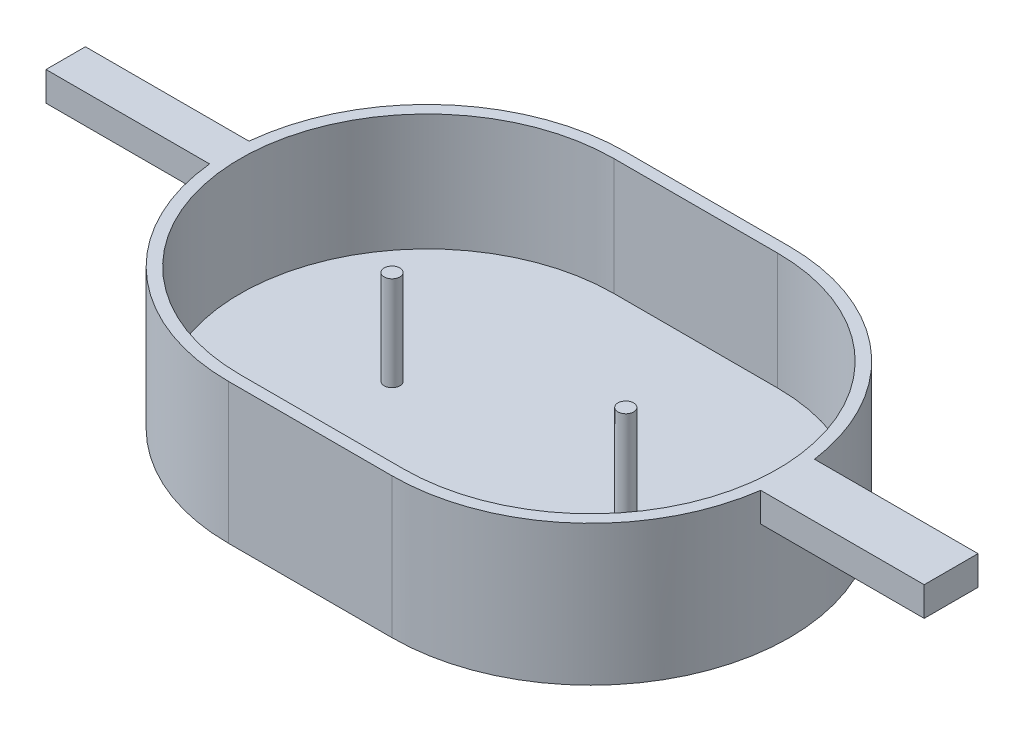
ISO-10303-21;
HEADER;
FILE_DESCRIPTION(('STEP AP214'),'2;1');
FILE_NAME('part.step','',(''),(''),'','','');
FILE_SCHEMA(('AUTOMOTIVE_DESIGN { 1 0 10303 214 1 1 1 1 }'));
ENDSEC;
DATA;
#1=APPLICATION_CONTEXT('core data for automotive mechanical design processes');
#2=APPLICATION_PROTOCOL_DEFINITION('international standard','automotive_design',2000,#1);
#3=PRODUCT_CONTEXT('',#1,'mechanical');
#4=PRODUCT('Part','Part','',(#3));
#5=PRODUCT_RELATED_PRODUCT_CATEGORY('part','',(#4));
#6=PRODUCT_DEFINITION_FORMATION('','',#4);
#7=PRODUCT_DEFINITION_CONTEXT('part definition',#1,'design');
#8=PRODUCT_DEFINITION('design','',#6,#7);
#9=PRODUCT_DEFINITION_SHAPE('','',#8);
#10=(LENGTH_UNIT() NAMED_UNIT(*) SI_UNIT(.MILLI.,.METRE.));
#11=(NAMED_UNIT(*) PLANE_ANGLE_UNIT() SI_UNIT($,.RADIAN.));
#12=(NAMED_UNIT(*) SI_UNIT($,.STERADIAN.) SOLID_ANGLE_UNIT());
#13=UNCERTAINTY_MEASURE_WITH_UNIT(LENGTH_MEASURE(1.E-05),#10,'distance_accuracy_value','');
#14=(GEOMETRIC_REPRESENTATION_CONTEXT(3) GLOBAL_UNCERTAINTY_ASSIGNED_CONTEXT((#13)) GLOBAL_UNIT_ASSIGNED_CONTEXT((#10,
#11,#12)) REPRESENTATION_CONTEXT('',''));
#15=CARTESIAN_POINT('',(0.,0.,0.));
#16=DIRECTION('',(0.,0.,1.));
#17=DIRECTION('',(1.,0.,0.));
#18=AXIS2_PLACEMENT_3D('',#15,#16,#17);
#19=CARTESIAN_POINT('',(0.,25.4,0.));
#20=DIRECTION('',(0.,1.,0.));
#21=DIRECTION('',(0.,0.,1.));
#22=AXIS2_PLACEMENT_3D('',#19,#20,#21);
#23=PLANE('',#22);
#24=DIRECTION('',(1.,0.,0.));
#25=VECTOR('',#24,1.);
#26=CARTESIAN_POINT('',(0.,25.4,40.64));
#27=LINE('',#26,#25);
#28=CARTESIAN_POINT('',(0.,25.4,40.64));
#29=VERTEX_POINT('',#28);
#30=CARTESIAN_POINT('',(35.56,25.4,40.64));
#31=VERTEX_POINT('',#30);
#32=EDGE_CURVE('E277',#29,#31,#27,.T.);
#33=ORIENTED_EDGE('',*,*,#32,.F.);
#34=CARTESIAN_POINT('',(0.,25.4,0.));
#35=DIRECTION('',(0.,1.,0.));
#36=DIRECTION('',(0.,0.,1.));
#37=AXIS2_PLACEMENT_3D('',#34,#35,#36);
#38=CIRCLE('',#37,40.64);
#39=CARTESIAN_POINT('',(0.,25.4,-40.64));
#40=VERTEX_POINT('',#39);
#41=EDGE_CURVE('E274',#40,#29,#38,.T.);
#42=ORIENTED_EDGE('',*,*,#41,.F.);
#43=DIRECTION('',(-1.,0.,0.));
#44=VECTOR('',#43,1.);
#45=CARTESIAN_POINT('',(0.,25.4,-40.64));
#46=LINE('',#45,#44);
#47=CARTESIAN_POINT('',(35.56,25.4,-40.64));
#48=VERTEX_POINT('',#47);
#49=EDGE_CURVE('E284',#48,#40,#46,.T.);
#50=ORIENTED_EDGE('',*,*,#49,.F.);
#51=CARTESIAN_POINT('',(35.56,25.4,0.));
#52=DIRECTION('',(0.,1.,0.));
#53=DIRECTION('',(0.,0.,1.));
#54=AXIS2_PLACEMENT_3D('',#51,#52,#53);
#55=CIRCLE('',#54,40.64);
#56=EDGE_CURVE('E281',#31,#48,#55,.T.);
#57=ORIENTED_EDGE('',*,*,#56,.F.);
#58=EDGE_LOOP('',(#33,#42,#50,#57));
#59=FACE_BOUND('',#58,.T.);
#60=DIRECTION('',(1.,0.,0.));
#61=VECTOR('',#60,1.);
#62=CARTESIAN_POINT('',(-40.411061774154,25.4,4.30763116869485));
#63=LINE('',#62,#61);
#64=CARTESIAN_POINT('',(-78.5163769047991,25.4,4.30763116869485));
#65=VERTEX_POINT('',#64);
#66=CARTESIAN_POINT('',(-42.9645983772046,25.4,4.30763116869485));
#67=VERTEX_POINT('',#66);
#68=EDGE_CURVE('E61',#65,#67,#63,.T.);
#69=ORIENTED_EDGE('',*,*,#68,.T.);
#70=CARTESIAN_POINT('',(0.,25.4,0.));
#71=DIRECTION('',(0.,1.,0.));
#72=DIRECTION('',(0.,0.,1.));
#73=AXIS2_PLACEMENT_3D('',#70,#71,#72);
#74=CIRCLE('',#73,43.18);
#75=CARTESIAN_POINT('',(0.,25.4,43.18));
#76=VERTEX_POINT('',#75);
#77=EDGE_CURVE('E314',#67,#76,#74,.T.);
#78=ORIENTED_EDGE('',*,*,#77,.T.);
#79=DIRECTION('',(1.,0.,0.));
#80=VECTOR('',#79,1.);
#81=CARTESIAN_POINT('',(0.,25.4,43.18));
#82=LINE('',#81,#80);
#83=CARTESIAN_POINT('',(35.56,25.4,43.18));
#84=VERTEX_POINT('',#83);
#85=EDGE_CURVE('E318',#76,#84,#82,.T.);
#86=ORIENTED_EDGE('',*,*,#85,.T.);
#87=CARTESIAN_POINT('',(35.56,25.4,0.));
#88=DIRECTION('',(0.,1.,0.));
#89=DIRECTION('',(0.,0.,1.));
#90=AXIS2_PLACEMENT_3D('',#87,#88,#89);
#91=CIRCLE('',#90,43.18);
#92=CARTESIAN_POINT('',(78.3422455503844,25.4,5.84738109469622));
#93=VERTEX_POINT('',#92);
#94=EDGE_CURVE('E322',#84,#93,#91,.T.);
#95=ORIENTED_EDGE('',*,*,#94,.T.);
#96=DIRECTION('',(1.,0.,0.));
#97=VECTOR('',#96,1.);
#98=CARTESIAN_POINT('',(75.777132348458,25.4,5.84738109469622));
#99=LINE('',#98,#97);
#100=CARTESIAN_POINT('',(113.877132348458,25.4,5.84738109469622));
#101=VERTEX_POINT('',#100);
#102=EDGE_CURVE('E203',#93,#101,#99,.T.);
#103=ORIENTED_EDGE('',*,*,#102,.T.);
#104=DIRECTION('',(0.,0.,-1.));
#105=VECTOR('',#104,1.);
#106=CARTESIAN_POINT('',(113.877132348458,25.4,-5.84738109469624));
#107=LINE('',#106,#105);
#108=CARTESIAN_POINT('',(113.877132348458,25.4,-5.84738109469624));
#109=VERTEX_POINT('',#108);
#110=EDGE_CURVE('E218',#101,#109,#107,.T.);
#111=ORIENTED_EDGE('',*,*,#110,.T.);
#112=DIRECTION('',(-1.,0.,0.));
#113=VECTOR('',#112,1.);
#114=CARTESIAN_POINT('',(75.777132348458,25.4,-5.84738109469624));
#115=LINE('',#114,#113);
#116=CARTESIAN_POINT('',(78.3422455503844,25.4,-5.84738109469624));
#117=VERTEX_POINT('',#116);
#118=EDGE_CURVE('E68',#109,#117,#115,.T.);
#119=ORIENTED_EDGE('',*,*,#118,.T.);
#120=CARTESIAN_POINT('',(35.56,25.4,-43.18));
#121=VERTEX_POINT('',#120);
#122=EDGE_CURVE('E321',#117,#121,#91,.T.);
#123=ORIENTED_EDGE('',*,*,#122,.T.);
#124=DIRECTION('',(-1.,0.,0.));
#125=VECTOR('',#124,1.);
#126=CARTESIAN_POINT('',(0.,25.4,-43.18));
#127=LINE('',#126,#125);
#128=CARTESIAN_POINT('',(0.,25.4,-43.18));
#129=VERTEX_POINT('',#128);
#130=EDGE_CURVE('E326',#121,#129,#127,.T.);
#131=ORIENTED_EDGE('',*,*,#130,.T.);
#132=CARTESIAN_POINT('',(-42.9695976489282,25.4,-4.25747318126848));
#133=VERTEX_POINT('',#132);
#134=EDGE_CURVE('E315',#129,#133,#74,.T.);
#135=ORIENTED_EDGE('',*,*,#134,.T.);
#136=DIRECTION('',(-1.,0.,0.));
#137=VECTOR('',#136,1.);
#138=CARTESIAN_POINT('',(-40.4163769047991,25.4,-4.25747318126848));
#139=LINE('',#138,#137);
#140=CARTESIAN_POINT('',(-78.5163769047991,25.4,-4.25747318126848));
#141=VERTEX_POINT('',#140);
#142=EDGE_CURVE('E172',#133,#141,#139,.T.);
#143=ORIENTED_EDGE('',*,*,#142,.T.);
#144=DIRECTION('',(0.,0.,1.));
#145=VECTOR('',#144,1.);
#146=CARTESIAN_POINT('',(-78.5163769047991,25.4,-4.25747318126848));
#147=LINE('',#146,#145);
#148=EDGE_CURVE('E162',#141,#65,#147,.T.);
#149=ORIENTED_EDGE('',*,*,#148,.T.);
#150=EDGE_LOOP('',(#69,#78,#86,#95,#103,#111,#119,#123,#131,#135,#143,#149));
#151=FACE_BOUND('',#150,.T.);
#152=ADVANCED_FACE('F45',(#59,#151),#23,.T.);
#153=CARTESIAN_POINT('',(0.,25.4,0.));
#154=DIRECTION('',(0.,-1.,0.));
#155=DIRECTION('',(0.,0.,-1.));
#156=AXIS2_PLACEMENT_3D('',#153,#154,#155);
#157=CYLINDRICAL_SURFACE('',#156,43.18);
#158=ORIENTED_EDGE('',*,*,#77,.F.);
#159=DIRECTION('',(0.,-1.,0.));
#160=VECTOR('',#159,1.);
#161=CARTESIAN_POINT('',(-42.9645983772046,25.4,4.30763116869485));
#162=LINE('',#161,#160);
#163=CARTESIAN_POINT('',(-42.9645983772046,19.05,4.30763116869485));
#164=VERTEX_POINT('',#163);
#165=EDGE_CURVE('E178',#67,#164,#162,.T.);
#166=ORIENTED_EDGE('',*,*,#165,.T.);
#167=CARTESIAN_POINT('',(0.,19.05,0.));
#168=DIRECTION('',(0.,1.,0.));
#169=DIRECTION('',(0.,0.,1.));
#170=AXIS2_PLACEMENT_3D('',#167,#168,#169);
#171=CIRCLE('',#170,43.18);
#172=CARTESIAN_POINT('',(-42.9695976489282,19.05,-4.25747318126848));
#173=VERTEX_POINT('',#172);
#174=EDGE_CURVE('E189',#173,#164,#171,.T.);
#175=ORIENTED_EDGE('',*,*,#174,.F.);
#176=DIRECTION('',(0.,-1.,0.));
#177=VECTOR('',#176,1.);
#178=CARTESIAN_POINT('',(-42.9695976489282,25.4,-4.25747318126848));
#179=LINE('',#178,#177);
#180=EDGE_CURVE('E197',#173,#133,#179,.F.);
#181=ORIENTED_EDGE('',*,*,#180,.T.);
#182=ORIENTED_EDGE('',*,*,#134,.F.);
#183=DIRECTION('',(0.,-1.,0.));
#184=VECTOR('',#183,1.);
#185=CARTESIAN_POINT('',(0.,25.4,-43.18));
#186=LINE('',#185,#184);
#187=CARTESIAN_POINT('',(0.,-5.08,-43.18));
#188=VERTEX_POINT('',#187);
#189=EDGE_CURVE('E329',#129,#188,#186,.T.);
#190=ORIENTED_EDGE('',*,*,#189,.T.);
#191=CARTESIAN_POINT('',(0.,-5.08,0.));
#192=DIRECTION('',(0.,1.,0.));
#193=DIRECTION('',(0.,0.,1.));
#194=AXIS2_PLACEMENT_3D('',#191,#192,#193);
#195=CIRCLE('',#194,43.18);
#196=CARTESIAN_POINT('',(0.,-5.08,43.18));
#197=VERTEX_POINT('',#196);
#198=EDGE_CURVE('E254',#188,#197,#195,.T.);
#199=ORIENTED_EDGE('',*,*,#198,.T.);
#200=DIRECTION('',(0.,-1.,0.));
#201=VECTOR('',#200,1.);
#202=CARTESIAN_POINT('',(0.,25.4,43.18));
#203=LINE('',#202,#201);
#204=EDGE_CURVE('E11',#76,#197,#203,.T.);
#205=ORIENTED_EDGE('',*,*,#204,.F.);
#206=EDGE_LOOP('',(#158,#166,#175,#181,#182,#190,#199,#205));
#207=FACE_BOUND('',#206,.T.);
#208=ADVANCED_FACE('F47',(#207),#157,.T.);
#209=CARTESIAN_POINT('',(0.,25.4,43.18));
#210=DIRECTION('',(0.,0.,-1.));
#211=DIRECTION('',(-1.,0.,0.));
#212=AXIS2_PLACEMENT_3D('',#209,#210,#211);
#213=PLANE('',#212);
#214=ORIENTED_EDGE('',*,*,#204,.T.);
#215=DIRECTION('',(1.,0.,0.));
#216=VECTOR('',#215,1.);
#217=CARTESIAN_POINT('',(0.,-5.08,43.18));
#218=LINE('',#217,#216);
#219=CARTESIAN_POINT('',(35.56,-5.08,43.18));
#220=VERTEX_POINT('',#219);
#221=EDGE_CURVE('E261',#197,#220,#218,.T.);
#222=ORIENTED_EDGE('',*,*,#221,.T.);
#223=DIRECTION('',(0.,-1.,0.));
#224=VECTOR('',#223,1.);
#225=CARTESIAN_POINT('',(35.56,25.4,43.18));
#226=LINE('',#225,#224);
#227=EDGE_CURVE('E54',#84,#220,#226,.T.);
#228=ORIENTED_EDGE('',*,*,#227,.F.);
#229=ORIENTED_EDGE('',*,*,#85,.F.);
#230=EDGE_LOOP('',(#214,#222,#228,#229));
#231=FACE_BOUND('',#230,.T.);
#232=ADVANCED_FACE('F349',(#231),#213,.F.);
#233=CARTESIAN_POINT('',(35.56,25.4,0.));
#234=DIRECTION('',(0.,-1.,0.));
#235=DIRECTION('',(0.,0.,-1.));
#236=AXIS2_PLACEMENT_3D('',#233,#234,#235);
#237=CYLINDRICAL_SURFACE('',#236,43.18);
#238=ORIENTED_EDGE('',*,*,#122,.F.);
#239=DIRECTION('',(0.,-1.,0.));
#240=VECTOR('',#239,1.);
#241=CARTESIAN_POINT('',(78.3422455503844,25.4,-5.84738109469624));
#242=LINE('',#241,#240);
#243=CARTESIAN_POINT('',(78.3422455503844,19.05,-5.84738109469624));
#244=VERTEX_POINT('',#243);
#245=EDGE_CURVE('E237',#117,#244,#242,.T.);
#246=ORIENTED_EDGE('',*,*,#245,.T.);
#247=CARTESIAN_POINT('',(35.56,19.05,0.));
#248=DIRECTION('',(0.,-1.,0.));
#249=DIRECTION('',(0.,0.,-1.));
#250=AXIS2_PLACEMENT_3D('',#247,#248,#249);
#251=CIRCLE('',#250,43.18);
#252=CARTESIAN_POINT('',(78.3422455503844,19.05,5.84738109469622));
#253=VERTEX_POINT('',#252);
#254=EDGE_CURVE('E226',#244,#253,#251,.T.);
#255=ORIENTED_EDGE('',*,*,#254,.T.);
#256=DIRECTION('',(0.,-1.,0.));
#257=VECTOR('',#256,1.);
#258=CARTESIAN_POINT('',(78.3422455503844,25.4,5.84738109469622));
#259=LINE('',#258,#257);
#260=EDGE_CURVE('E233',#253,#93,#259,.F.);
#261=ORIENTED_EDGE('',*,*,#260,.T.);
#262=ORIENTED_EDGE('',*,*,#94,.F.);
#263=ORIENTED_EDGE('',*,*,#227,.T.);
#264=CARTESIAN_POINT('',(35.56,-5.08,0.));
#265=DIRECTION('',(0.,1.,0.));
#266=DIRECTION('',(0.,0.,1.));
#267=AXIS2_PLACEMENT_3D('',#264,#265,#266);
#268=CIRCLE('',#267,43.18);
#269=CARTESIAN_POINT('',(35.56,-5.08,-43.18));
#270=VERTEX_POINT('',#269);
#271=EDGE_CURVE('E265',#220,#270,#268,.T.);
#272=ORIENTED_EDGE('',*,*,#271,.T.);
#273=DIRECTION('',(0.,-1.,0.));
#274=VECTOR('',#273,1.);
#275=CARTESIAN_POINT('',(35.56,25.4,-43.18));
#276=LINE('',#275,#274);
#277=EDGE_CURVE('E332',#121,#270,#276,.T.);
#278=ORIENTED_EDGE('',*,*,#277,.F.);
#279=EDGE_LOOP('',(#238,#246,#255,#261,#262,#263,#272,#278));
#280=FACE_BOUND('',#279,.T.);
#281=ADVANCED_FACE('F340',(#280),#237,.T.);
#282=CARTESIAN_POINT('',(0.,25.4,-43.18));
#283=DIRECTION('',(0.,0.,1.));
#284=DIRECTION('',(1.,0.,0.));
#285=AXIS2_PLACEMENT_3D('',#282,#283,#284);
#286=PLANE('',#285);
#287=ORIENTED_EDGE('',*,*,#277,.T.);
#288=DIRECTION('',(-1.,0.,0.));
#289=VECTOR('',#288,1.);
#290=CARTESIAN_POINT('',(0.,-5.08,-43.18));
#291=LINE('',#290,#289);
#292=EDGE_CURVE('E269',#270,#188,#291,.T.);
#293=ORIENTED_EDGE('',*,*,#292,.T.);
#294=ORIENTED_EDGE('',*,*,#189,.F.);
#295=ORIENTED_EDGE('',*,*,#130,.F.);
#296=EDGE_LOOP('',(#287,#293,#294,#295));
#297=FACE_BOUND('',#296,.T.);
#298=ADVANCED_FACE('F355',(#297),#286,.F.);
#299=CARTESIAN_POINT('',(0.,25.4,0.));
#300=DIRECTION('',(0.,-1.,0.));
#301=DIRECTION('',(0.,0.,-1.));
#302=AXIS2_PLACEMENT_3D('',#299,#300,#301);
#303=CYLINDRICAL_SURFACE('',#302,40.64);
#304=ORIENTED_EDGE('',*,*,#41,.T.);
#305=DIRECTION('',(0.,-1.,0.));
#306=VECTOR('',#305,1.);
#307=CARTESIAN_POINT('',(0.,25.4,40.64));
#308=LINE('',#307,#306);
#309=CARTESIAN_POINT('',(0.,0.,40.64));
#310=VERTEX_POINT('',#309);
#311=EDGE_CURVE('E310',#29,#310,#308,.T.);
#312=ORIENTED_EDGE('',*,*,#311,.T.);
#313=CARTESIAN_POINT('',(0.,0.,0.));
#314=DIRECTION('',(0.,1.,0.));
#315=DIRECTION('',(0.,0.,1.));
#316=AXIS2_PLACEMENT_3D('',#313,#314,#315);
#317=CIRCLE('',#316,40.64);
#318=CARTESIAN_POINT('',(0.,0.,-40.64));
#319=VERTEX_POINT('',#318);
#320=EDGE_CURVE('E273',#319,#310,#317,.T.);
#321=ORIENTED_EDGE('',*,*,#320,.F.);
#322=DIRECTION('',(0.,-1.,0.));
#323=VECTOR('',#322,1.);
#324=CARTESIAN_POINT('',(0.,25.4,-40.64));
#325=LINE('',#324,#323);
#326=EDGE_CURVE('E287',#40,#319,#325,.T.);
#327=ORIENTED_EDGE('',*,*,#326,.F.);
#328=EDGE_LOOP('',(#304,#312,#321,#327));
#329=FACE_BOUND('',#328,.T.);
#330=ADVANCED_FACE('F393',(#329),#303,.F.);
#331=CARTESIAN_POINT('',(0.,25.4,40.64));
#332=DIRECTION('',(0.,0.,-1.));
#333=DIRECTION('',(-1.,0.,0.));
#334=AXIS2_PLACEMENT_3D('',#331,#332,#333);
#335=PLANE('',#334);
#336=DIRECTION('',(1.,0.,0.));
#337=VECTOR('',#336,1.);
#338=CARTESIAN_POINT('',(0.,0.,40.64));
#339=LINE('',#338,#337);
#340=CARTESIAN_POINT('',(35.56,0.,40.64));
#341=VERTEX_POINT('',#340);
#342=EDGE_CURVE('E291',#310,#341,#339,.T.);
#343=ORIENTED_EDGE('',*,*,#342,.F.);
#344=ORIENTED_EDGE('',*,*,#311,.F.);
#345=ORIENTED_EDGE('',*,*,#32,.T.);
#346=DIRECTION('',(0.,-1.,0.));
#347=VECTOR('',#346,1.);
#348=CARTESIAN_POINT('',(35.56,25.4,40.64));
#349=LINE('',#348,#347);
#350=EDGE_CURVE('E307',#31,#341,#349,.T.);
#351=ORIENTED_EDGE('',*,*,#350,.T.);
#352=EDGE_LOOP('',(#343,#344,#345,#351));
#353=FACE_BOUND('',#352,.T.);
#354=ADVANCED_FACE('F424',(#353),#335,.T.);
#355=CARTESIAN_POINT('',(35.56,25.4,0.));
#356=DIRECTION('',(0.,-1.,0.));
#357=DIRECTION('',(0.,0.,-1.));
#358=AXIS2_PLACEMENT_3D('',#355,#356,#357);
#359=CYLINDRICAL_SURFACE('',#358,40.64);
#360=ORIENTED_EDGE('',*,*,#56,.T.);
#361=DIRECTION('',(0.,-1.,0.));
#362=VECTOR('',#361,1.);
#363=CARTESIAN_POINT('',(35.56,25.4,-40.64));
#364=LINE('',#363,#362);
#365=CARTESIAN_POINT('',(35.56,0.,-40.64));
#366=VERTEX_POINT('',#365);
#367=EDGE_CURVE('E304',#48,#366,#364,.T.);
#368=ORIENTED_EDGE('',*,*,#367,.T.);
#369=CARTESIAN_POINT('',(35.56,0.,0.));
#370=DIRECTION('',(0.,1.,0.));
#371=DIRECTION('',(0.,0.,1.));
#372=AXIS2_PLACEMENT_3D('',#369,#370,#371);
#373=CIRCLE('',#372,40.64);
#374=EDGE_CURVE('E295',#341,#366,#373,.T.);
#375=ORIENTED_EDGE('',*,*,#374,.F.);
#376=ORIENTED_EDGE('',*,*,#350,.F.);
#377=EDGE_LOOP('',(#360,#368,#375,#376));
#378=FACE_BOUND('',#377,.T.);
#379=ADVANCED_FACE('F435',(#378),#359,.F.);
#380=CARTESIAN_POINT('',(0.,25.4,-40.64));
#381=DIRECTION('',(0.,0.,1.));
#382=DIRECTION('',(1.,0.,0.));
#383=AXIS2_PLACEMENT_3D('',#380,#381,#382);
#384=PLANE('',#383);
#385=DIRECTION('',(-1.,0.,0.));
#386=VECTOR('',#385,1.);
#387=CARTESIAN_POINT('',(0.,0.,-40.64));
#388=LINE('',#387,#386);
#389=EDGE_CURVE('E278',#366,#319,#388,.T.);
#390=ORIENTED_EDGE('',*,*,#389,.F.);
#391=ORIENTED_EDGE('',*,*,#367,.F.);
#392=ORIENTED_EDGE('',*,*,#49,.T.);
#393=ORIENTED_EDGE('',*,*,#326,.T.);
#394=EDGE_LOOP('',(#390,#391,#392,#393));
#395=FACE_BOUND('',#394,.T.);
#396=ADVANCED_FACE('F443',(#395),#384,.T.);
#397=CARTESIAN_POINT('',(0.,0.,0.));
#398=DIRECTION('',(0.,1.,0.));
#399=DIRECTION('',(0.,0.,1.));
#400=AXIS2_PLACEMENT_3D('',#397,#398,#399);
#401=PLANE('',#400);
#402=CARTESIAN_POINT('',(-7.62,0.,0.));
#403=DIRECTION('',(0.,1.,0.));
#404=DIRECTION('',(0.,0.,1.));
#405=AXIS2_PLACEMENT_3D('',#402,#403,#404);
#406=CIRCLE('',#405,1.7018);
#407=CARTESIAN_POINT('',(-7.62,0.,1.7018));
#408=VERTEX_POINT('',#407);
#409=EDGE_CURVE('E242',#408,#408,#406,.T.);
#410=ORIENTED_EDGE('',*,*,#409,.F.);
#411=EDGE_LOOP('',(#410));
#412=FACE_BOUND('',#411,.T.);
#413=CARTESIAN_POINT('',(43.18,0.,0.));
#414=DIRECTION('',(0.,1.,0.));
#415=DIRECTION('',(0.,0.,1.));
#416=AXIS2_PLACEMENT_3D('',#413,#414,#415);
#417=CIRCLE('',#416,1.7018);
#418=CARTESIAN_POINT('',(43.18,0.,1.7018));
#419=VERTEX_POINT('',#418);
#420=EDGE_CURVE('E246',#419,#419,#417,.T.);
#421=ORIENTED_EDGE('',*,*,#420,.F.);
#422=EDGE_LOOP('',(#421));
#423=FACE_BOUND('',#422,.T.);
#424=ORIENTED_EDGE('',*,*,#389,.T.);
#425=ORIENTED_EDGE('',*,*,#320,.T.);
#426=ORIENTED_EDGE('',*,*,#342,.T.);
#427=ORIENTED_EDGE('',*,*,#374,.T.);
#428=EDGE_LOOP('',(#424,#425,#426,#427));
#429=FACE_BOUND('',#428,.T.);
#430=ADVANCED_FACE('F454',(#412,#423,#429),#401,.T.);
#431=CARTESIAN_POINT('',(0.,-5.08,0.));
#432=DIRECTION('',(0.,1.,0.));
#433=DIRECTION('',(0.,0.,1.));
#434=AXIS2_PLACEMENT_3D('',#431,#432,#433);
#435=PLANE('',#434);
#436=ORIENTED_EDGE('',*,*,#198,.F.);
#437=ORIENTED_EDGE('',*,*,#292,.F.);
#438=ORIENTED_EDGE('',*,*,#271,.F.);
#439=ORIENTED_EDGE('',*,*,#221,.F.);
#440=EDGE_LOOP('',(#436,#437,#438,#439));
#441=FACE_BOUND('',#440,.T.);
#442=ADVANCED_FACE('F348',(#441),#435,.F.);
#443=CARTESIAN_POINT('',(43.18,20.4964,0.));
#444=DIRECTION('',(0.,-1.,0.));
#445=DIRECTION('',(0.,0.,-1.));
#446=AXIS2_PLACEMENT_3D('',#443,#444,#445);
#447=CYLINDRICAL_SURFACE('',#446,1.7018);
#448=CARTESIAN_POINT('',(43.18,20.4964,0.));
#449=DIRECTION('',(0.,1.,0.));
#450=DIRECTION('',(0.,0.,1.));
#451=AXIS2_PLACEMENT_3D('',#448,#449,#450);
#452=CIRCLE('',#451,1.7018);
#453=CARTESIAN_POINT('',(43.18,20.4964,1.7018));
#454=VERTEX_POINT('',#453);
#455=EDGE_CURVE('E250',#454,#454,#452,.T.);
#456=ORIENTED_EDGE('',*,*,#455,.F.);
#457=EDGE_LOOP('',(#456));
#458=FACE_BOUND('',#457,.T.);
#459=ORIENTED_EDGE('',*,*,#420,.T.);
#460=EDGE_LOOP('',(#459));
#461=FACE_BOUND('',#460,.T.);
#462=ADVANCED_FACE('F469',(#458,#461),#447,.T.);
#463=CARTESIAN_POINT('',(43.18,20.4964,0.));
#464=DIRECTION('',(0.,1.,0.));
#465=DIRECTION('',(0.,0.,1.));
#466=AXIS2_PLACEMENT_3D('',#463,#464,#465);
#467=PLANE('',#466);
#468=ORIENTED_EDGE('',*,*,#455,.T.);
#469=EDGE_LOOP('',(#468));
#470=FACE_BOUND('',#469,.T.);
#471=ADVANCED_FACE('F475',(#470),#467,.T.);
#472=CARTESIAN_POINT('',(-7.62,20.4964,0.));
#473=DIRECTION('',(0.,-1.,0.));
#474=DIRECTION('',(0.,0.,-1.));
#475=AXIS2_PLACEMENT_3D('',#472,#473,#474);
#476=CYLINDRICAL_SURFACE('',#475,1.7018);
#477=CARTESIAN_POINT('',(-7.62,20.4964,0.));
#478=DIRECTION('',(0.,1.,0.));
#479=DIRECTION('',(0.,0.,1.));
#480=AXIS2_PLACEMENT_3D('',#477,#478,#479);
#481=CIRCLE('',#480,1.7018);
#482=CARTESIAN_POINT('',(-7.62,20.4964,1.7018));
#483=VERTEX_POINT('',#482);
#484=EDGE_CURVE('E241',#483,#483,#481,.T.);
#485=ORIENTED_EDGE('',*,*,#484,.F.);
#486=EDGE_LOOP('',(#485));
#487=FACE_BOUND('',#486,.T.);
#488=ORIENTED_EDGE('',*,*,#409,.T.);
#489=EDGE_LOOP('',(#488));
#490=FACE_BOUND('',#489,.T.);
#491=ADVANCED_FACE('F483',(#487,#490),#476,.T.);
#492=CARTESIAN_POINT('',(-7.62,20.4964,0.));
#493=DIRECTION('',(0.,1.,0.));
#494=DIRECTION('',(0.,0.,1.));
#495=AXIS2_PLACEMENT_3D('',#492,#493,#494);
#496=PLANE('',#495);
#497=ORIENTED_EDGE('',*,*,#484,.T.);
#498=EDGE_LOOP('',(#497));
#499=FACE_BOUND('',#498,.T.);
#500=ADVANCED_FACE('F490',(#499),#496,.T.);
#501=CARTESIAN_POINT('',(75.777132348458,19.05,-5.84738109469624));
#502=DIRECTION('',(0.,0.,-1.));
#503=DIRECTION('',(-1.,0.,0.));
#504=AXIS2_PLACEMENT_3D('',#501,#502,#503);
#505=PLANE('',#504);
#506=ORIENTED_EDGE('',*,*,#245,.F.);
#507=ORIENTED_EDGE('',*,*,#118,.F.);
#508=DIRECTION('',(0.,1.,0.));
#509=VECTOR('',#508,1.);
#510=CARTESIAN_POINT('',(113.877132348458,19.05,-5.84738109469624));
#511=LINE('',#510,#509);
#512=CARTESIAN_POINT('',(113.877132348458,19.05,-5.84738109469624));
#513=VERTEX_POINT('',#512);
#514=EDGE_CURVE('E223',#513,#109,#511,.T.);
#515=ORIENTED_EDGE('',*,*,#514,.F.);
#516=DIRECTION('',(-1.,0.,0.));
#517=VECTOR('',#516,1.);
#518=CARTESIAN_POINT('',(75.777132348458,19.05,-5.84738109469624));
#519=LINE('',#518,#517);
#520=EDGE_CURVE('E211',#513,#244,#519,.T.);
#521=ORIENTED_EDGE('',*,*,#520,.T.);
#522=EDGE_LOOP('',(#506,#507,#515,#521));
#523=FACE_BOUND('',#522,.T.);
#524=ADVANCED_FACE('F369',(#523),#505,.T.);
#525=CARTESIAN_POINT('',(75.777132348458,19.05,5.84738109469622));
#526=DIRECTION('',(0.,0.,1.));
#527=DIRECTION('',(1.,0.,0.));
#528=AXIS2_PLACEMENT_3D('',#525,#526,#527);
#529=PLANE('',#528);
#530=ORIENTED_EDGE('',*,*,#260,.F.);
#531=DIRECTION('',(1.,0.,0.));
#532=VECTOR('',#531,1.);
#533=CARTESIAN_POINT('',(75.777132348458,19.05,5.84738109469622));
#534=LINE('',#533,#532);
#535=CARTESIAN_POINT('',(113.877132348458,19.05,5.84738109469622));
#536=VERTEX_POINT('',#535);
#537=EDGE_CURVE('E204',#253,#536,#534,.T.);
#538=ORIENTED_EDGE('',*,*,#537,.T.);
#539=DIRECTION('',(0.,1.,0.));
#540=VECTOR('',#539,1.);
#541=CARTESIAN_POINT('',(113.877132348458,19.05,5.84738109469622));
#542=LINE('',#541,#540);
#543=EDGE_CURVE('E215',#536,#101,#542,.T.);
#544=ORIENTED_EDGE('',*,*,#543,.T.);
#545=ORIENTED_EDGE('',*,*,#102,.F.);
#546=EDGE_LOOP('',(#530,#538,#544,#545));
#547=FACE_BOUND('',#546,.T.);
#548=ADVANCED_FACE('F362',(#547),#529,.T.);
#549=CARTESIAN_POINT('',(35.5599999999983,19.05,0.));
#550=DIRECTION('',(0.,-1.,0.));
#551=DIRECTION('',(0.,0.,-1.));
#552=AXIS2_PLACEMENT_3D('',#549,#550,#551);
#553=PLANE('',#552);
#554=ORIENTED_EDGE('',*,*,#254,.F.);
#555=ORIENTED_EDGE('',*,*,#520,.F.);
#556=DIRECTION('',(0.,0.,-1.));
#557=VECTOR('',#556,1.);
#558=CARTESIAN_POINT('',(113.877132348458,19.05,-5.84738109469624));
#559=LINE('',#558,#557);
#560=EDGE_CURVE('E207',#536,#513,#559,.T.);
#561=ORIENTED_EDGE('',*,*,#560,.F.);
#562=ORIENTED_EDGE('',*,*,#537,.F.);
#563=EDGE_LOOP('',(#554,#555,#561,#562));
#564=FACE_BOUND('',#563,.T.);
#565=ADVANCED_FACE('F371',(#564),#553,.T.);
#566=CARTESIAN_POINT('',(113.877132348458,19.05,-5.84738109469624));
#567=DIRECTION('',(1.,0.,0.));
#568=DIRECTION('',(0.,0.,-1.));
#569=AXIS2_PLACEMENT_3D('',#566,#567,#568);
#570=PLANE('',#569);
#571=ORIENTED_EDGE('',*,*,#110,.F.);
#572=ORIENTED_EDGE('',*,*,#543,.F.);
#573=ORIENTED_EDGE('',*,*,#560,.T.);
#574=ORIENTED_EDGE('',*,*,#514,.T.);
#575=EDGE_LOOP('',(#571,#572,#573,#574));
#576=FACE_BOUND('',#575,.T.);
#577=ADVANCED_FACE('F366',(#576),#570,.T.);
#578=CARTESIAN_POINT('',(-40.411061774154,19.05,4.30763116869485));
#579=DIRECTION('',(0.,0.,1.));
#580=DIRECTION('',(1.,0.,0.));
#581=AXIS2_PLACEMENT_3D('',#578,#579,#580);
#582=PLANE('',#581);
#583=ORIENTED_EDGE('',*,*,#165,.F.);
#584=ORIENTED_EDGE('',*,*,#68,.F.);
#585=DIRECTION('',(0.,1.,0.));
#586=VECTOR('',#585,1.);
#587=CARTESIAN_POINT('',(-78.5163769047991,19.05,4.30763116869485));
#588=LINE('',#587,#586);
#589=CARTESIAN_POINT('',(-78.5163769047991,19.05,4.30763116869485));
#590=VERTEX_POINT('',#589);
#591=EDGE_CURVE('E159',#590,#65,#588,.T.);
#592=ORIENTED_EDGE('',*,*,#591,.F.);
#593=DIRECTION('',(1.,0.,0.));
#594=VECTOR('',#593,1.);
#595=CARTESIAN_POINT('',(-40.411061774154,19.05,4.30763116869485));
#596=LINE('',#595,#594);
#597=EDGE_CURVE('E190',#590,#164,#596,.T.);
#598=ORIENTED_EDGE('',*,*,#597,.T.);
#599=EDGE_LOOP('',(#583,#584,#592,#598));
#600=FACE_BOUND('',#599,.T.);
#601=ADVANCED_FACE('F176',(#600),#582,.T.);
#602=CARTESIAN_POINT('',(-40.4163769047991,19.05,-4.25747318126848));
#603=DIRECTION('',(0.,0.,-1.));
#604=DIRECTION('',(-1.,0.,0.));
#605=AXIS2_PLACEMENT_3D('',#602,#603,#604);
#606=PLANE('',#605);
#607=ORIENTED_EDGE('',*,*,#180,.F.);
#608=DIRECTION('',(-1.,0.,0.));
#609=VECTOR('',#608,1.);
#610=CARTESIAN_POINT('',(-40.4163769047991,19.05,-4.25747318126848));
#611=LINE('',#610,#609);
#612=CARTESIAN_POINT('',(-78.5163769047991,19.05,-4.25747318126848));
#613=VERTEX_POINT('',#612);
#614=EDGE_CURVE('E181',#173,#613,#611,.T.);
#615=ORIENTED_EDGE('',*,*,#614,.T.);
#616=DIRECTION('',(0.,1.,0.));
#617=VECTOR('',#616,1.);
#618=CARTESIAN_POINT('',(-78.5163769047991,19.05,-4.25747318126848));
#619=LINE('',#618,#617);
#620=EDGE_CURVE('E169',#613,#141,#619,.T.);
#621=ORIENTED_EDGE('',*,*,#620,.T.);
#622=ORIENTED_EDGE('',*,*,#142,.F.);
#623=EDGE_LOOP('',(#607,#615,#621,#622));
#624=FACE_BOUND('',#623,.T.);
#625=ADVANCED_FACE('F546',(#624),#606,.T.);
#626=CARTESIAN_POINT('',(6.44623243672982E-12,19.05,0.));
#627=DIRECTION('',(0.,1.,0.));
#628=DIRECTION('',(0.,0.,1.));
#629=AXIS2_PLACEMENT_3D('',#626,#627,#628);
#630=PLANE('',#629);
#631=ORIENTED_EDGE('',*,*,#614,.F.);
#632=ORIENTED_EDGE('',*,*,#174,.T.);
#633=ORIENTED_EDGE('',*,*,#597,.F.);
#634=DIRECTION('',(0.,0.,1.));
#635=VECTOR('',#634,1.);
#636=CARTESIAN_POINT('',(-78.5163769047991,19.05,-4.25747318126848));
#637=LINE('',#636,#635);
#638=EDGE_CURVE('E164',#613,#590,#637,.T.);
#639=ORIENTED_EDGE('',*,*,#638,.F.);
#640=EDGE_LOOP('',(#631,#632,#633,#639));
#641=FACE_BOUND('',#640,.T.);
#642=ADVANCED_FACE('F556',(#641),#630,.F.);
#643=CARTESIAN_POINT('',(-78.5163769047991,19.05,-4.25747318126848));
#644=DIRECTION('',(-1.,0.,0.));
#645=DIRECTION('',(0.,0.,1.));
#646=AXIS2_PLACEMENT_3D('',#643,#644,#645);
#647=PLANE('',#646);
#648=ORIENTED_EDGE('',*,*,#148,.F.);
#649=ORIENTED_EDGE('',*,*,#620,.F.);
#650=ORIENTED_EDGE('',*,*,#638,.T.);
#651=ORIENTED_EDGE('',*,*,#591,.T.);
#652=EDGE_LOOP('',(#648,#649,#650,#651));
#653=FACE_BOUND('',#652,.T.);
#654=ADVANCED_FACE('F160',(#653),#647,.T.);
#655=CLOSED_SHELL('',(#152,#208,#232,#281,#298,#330,#354,#379,#396,#430,#442,#462,#471,#491,
#500,#524,#548,#565,#577,#601,#625,#642,#654));
#656=MANIFOLD_SOLID_BREP('B2',#655);
#657=ADVANCED_BREP_SHAPE_REPRESENTATION('',(#18,#656),#14);
#658=SHAPE_DEFINITION_REPRESENTATION(#9,#657);
ENDSEC;
END-ISO-10303-21;
